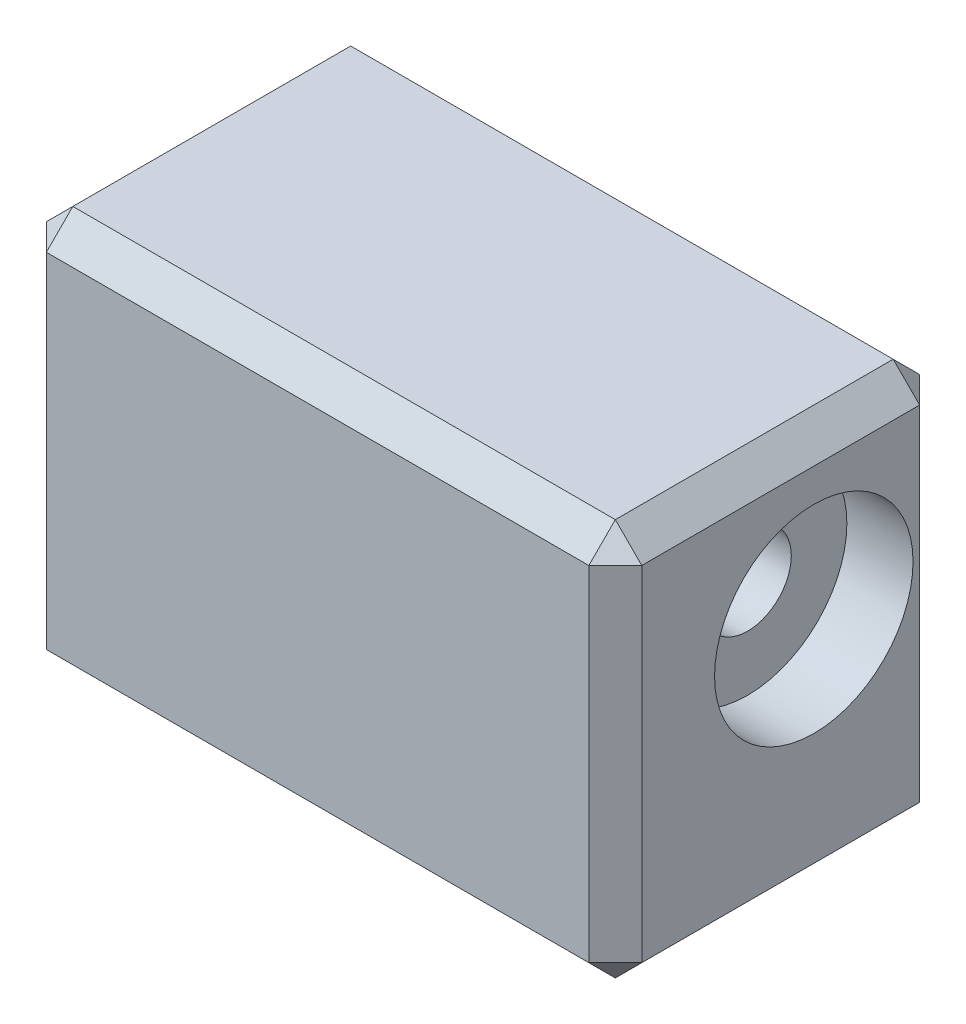
ISO-10303-21;
HEADER;
FILE_DESCRIPTION(('STEP AP214'),'2;1');
FILE_NAME('part.step','',(''),(''),'','','');
FILE_SCHEMA(('AUTOMOTIVE_DESIGN { 1 0 10303 214 1 1 1 1 }'));
ENDSEC;
DATA;
#1=APPLICATION_CONTEXT('core data for automotive mechanical design processes');
#2=APPLICATION_PROTOCOL_DEFINITION('international standard','automotive_design',2000,#1);
#3=PRODUCT_CONTEXT('',#1,'mechanical');
#4=PRODUCT('Part','Part','',(#3));
#5=PRODUCT_RELATED_PRODUCT_CATEGORY('part','',(#4));
#6=PRODUCT_DEFINITION_FORMATION('','',#4);
#7=PRODUCT_DEFINITION_CONTEXT('part definition',#1,'design');
#8=PRODUCT_DEFINITION('design','',#6,#7);
#9=PRODUCT_DEFINITION_SHAPE('','',#8);
#10=(LENGTH_UNIT() NAMED_UNIT(*) SI_UNIT(.MILLI.,.METRE.));
#11=(NAMED_UNIT(*) PLANE_ANGLE_UNIT() SI_UNIT($,.RADIAN.));
#12=(NAMED_UNIT(*) SI_UNIT($,.STERADIAN.) SOLID_ANGLE_UNIT());
#13=UNCERTAINTY_MEASURE_WITH_UNIT(LENGTH_MEASURE(1.E-05),#10,'distance_accuracy_value','');
#14=(GEOMETRIC_REPRESENTATION_CONTEXT(3) GLOBAL_UNCERTAINTY_ASSIGNED_CONTEXT((#13)) GLOBAL_UNIT_ASSIGNED_CONTEXT((#10,
#11,#12)) REPRESENTATION_CONTEXT('',''));
#15=CARTESIAN_POINT('',(0.,0.,0.));
#16=DIRECTION('',(0.,0.,1.));
#17=DIRECTION('',(1.,0.,0.));
#18=AXIS2_PLACEMENT_3D('',#15,#16,#17);
#19=CARTESIAN_POINT('',(0.,18.,-15.));
#20=DIRECTION('',(1.,0.,0.));
#21=DIRECTION('',(0.,0.,-1.));
#22=AXIS2_PLACEMENT_3D('',#19,#20,#21);
#23=CYLINDRICAL_SURFACE('',#22,3.29999999999999);
#24=CARTESIAN_POINT('',(-32.5,18.,-11.7));
#25=CARTESIAN_POINT('',(-32.5000002512976,18.180160664798,-11.6999995149712));
#26=CARTESIAN_POINT('',(-32.4950862523575,18.3603191481547,-11.7148016749699));
#27=CARTESIAN_POINT('',(-32.475966963423,18.7153357503385,-11.7734422990553));
#28=CARTESIAN_POINT('',(-32.4617605251427,18.8901932113126,-11.8172843516706));
#29=CARTESIAN_POINT('',(-32.425601362864,19.2294381519048,-11.9323426247766));
#30=CARTESIAN_POINT('',(-32.4036614375337,19.3938424037999,-12.0035136340281));
#31=CARTESIAN_POINT('',(-32.3542789449768,19.708381291749,-12.1710071453837));
#32=CARTESIAN_POINT('',(-32.3268353267193,19.8585131941521,-12.2673344526069));
#33=CARTESIAN_POINT('',(-32.2682933595203,20.1453540051203,-12.4858496461428));
#34=CARTESIAN_POINT('',(-32.2371087377317,20.281510042736,-12.6087400365483));
#35=CARTESIAN_POINT('',(-32.1750781560801,20.5317009452083,-12.8753990278397));
#36=CARTESIAN_POINT('',(-32.1442322701586,20.645731067395,-13.0191720933854));
#37=CARTESIAN_POINT('',(-32.0854262634667,20.8515631102477,-13.3284612247589));
#38=CARTESIAN_POINT('',(-32.0575714979767,20.9426509429274,-13.4944744751703));
#39=CARTESIAN_POINT('',(-32.0092109896754,21.095379000141,-13.8405312616682));
#40=CARTESIAN_POINT('',(-31.9887030555499,21.1570280071223,-14.0205705947047));
#41=CARTESIAN_POINT('',(-31.958265652702,21.2470626998285,-14.3832896581625));
#42=CARTESIAN_POINT('',(-31.9480082447153,21.2764826834664,-14.5656843266513));
#43=CARTESIAN_POINT('',(-31.938262692959,21.3044572232771,-14.933087225388));
#44=CARTESIAN_POINT('',(-31.9387712995073,21.3030210932527,-15.1180946501355));
#45=CARTESIAN_POINT('',(-31.9502125821514,21.2701282019744,-15.4766944047846));
#46=CARTESIAN_POINT('',(-31.9606785775936,21.2400153930326,-15.6504274704776));
#47=CARTESIAN_POINT('',(-31.9900926504697,21.1528141786995,-15.9902218123335));
#48=CARTESIAN_POINT('',(-32.0090417245488,21.0957226036301,-16.1562821845305));
#49=CARTESIAN_POINT('',(-32.05362347882,20.9552934848174,-16.4790948799893));
#50=CARTESIAN_POINT('',(-32.0793574389537,20.8715538624727,-16.6356577004506));
#51=CARTESIAN_POINT('',(-32.1345663183206,20.6804848477663,-16.932936724603));
#52=CARTESIAN_POINT('',(-32.1640422997438,20.5731487510831,-17.0736484073881));
#53=CARTESIAN_POINT('',(-32.2252559648513,20.3314560346881,-17.3427904548204));
#54=CARTESIAN_POINT('',(-32.2570322518803,20.1959989077779,-17.4702257572863));
#55=CARTESIAN_POINT('',(-32.3179466917306,19.9052447271162,-17.7008283564784));
#56=CARTESIAN_POINT('',(-32.3470846013613,19.7499458476394,-17.80399341751));
#57=CARTESIAN_POINT('',(-32.3998085851988,19.4218377567204,-17.983907033674));
#58=CARTESIAN_POINT('',(-32.4233389587223,19.248875430006,-18.0603937944261));
#59=CARTESIAN_POINT('',(-32.4617926902947,18.8915776411687,-18.1828794392126));
#60=CARTESIAN_POINT('',(-32.4767189759167,18.7072460711333,-18.2288886941282));
#61=CARTESIAN_POINT('',(-32.4958000385908,18.3408698738856,-18.2873615707665));
#62=CARTESIAN_POINT('',(-32.5003864168188,18.1590620898807,-18.3011701872789));
#63=CARTESIAN_POINT('',(-32.4995624079864,17.7956940058516,-18.2986747346175));
#64=CARTESIAN_POINT('',(-32.4941536704685,17.6141336699386,-18.2823756342665));
#65=CARTESIAN_POINT('',(-32.4742318578163,17.26176544781,-18.2211943476342));
#66=CARTESIAN_POINT('',(-32.4599805961299,17.0907986858431,-18.1771335799709));
#67=CARTESIAN_POINT('',(-32.4240722043328,16.758749213228,-18.0627026169765));
#68=CARTESIAN_POINT('',(-32.4024141336752,16.5976677609223,-17.9923290802362));
#69=CARTESIAN_POINT('',(-32.3531947638051,16.2852928322987,-17.8252379608953));
#70=CARTESIAN_POINT('',(-32.3254945719897,16.1343629227264,-17.727882770471));
#71=CARTESIAN_POINT('',(-32.2673361267806,15.8505424044173,-17.5103435304082));
#72=CARTESIAN_POINT('',(-32.2368770474717,15.7176572276007,-17.3901526326521));
#73=CARTESIAN_POINT('',(-32.1749181969498,15.4675490429625,-17.1240276546161));
#74=CARTESIAN_POINT('',(-32.1434324032,15.3512856810013,-16.9771862661526));
#75=CARTESIAN_POINT('',(-32.0843713409326,15.1449371451529,-16.6654002902126));
#76=CARTESIAN_POINT('',(-32.0567960873326,15.0548520711271,-16.5004556336815));
#77=CARTESIAN_POINT('',(-32.0089549374067,14.9038618312959,-16.1571490320833));
#78=CARTESIAN_POINT('',(-31.9886717638273,14.8428875786643,-15.9788200280456));
#79=CARTESIAN_POINT('',(-31.957985324936,14.7520999216941,-15.6136041958408));
#80=CARTESIAN_POINT('',(-31.9475777255182,14.7222728471752,-15.426721159576));
#81=CARTESIAN_POINT('',(-31.9383070548971,14.6956790104583,-15.0598291501742));
#82=CARTESIAN_POINT('',(-31.9388888483573,14.6973225526984,-14.8799481272437));
#83=CARTESIAN_POINT('',(-31.9501627898112,14.7297231487097,-14.5231668008197));
#84=CARTESIAN_POINT('',(-31.9608543586442,14.7604785347449,-14.3462663271698));
#85=CARTESIAN_POINT('',(-31.9907338752892,14.8491141624954,-14.0036717256308));
#86=CARTESIAN_POINT('',(-32.0097633057873,14.9064894581406,-13.8378320556851));
#87=CARTESIAN_POINT('',(-32.0541187123027,15.0463291811991,-13.5180050146749));
#88=CARTESIAN_POINT('',(-32.0794460678687,15.1287991064305,-13.3640202500962));
#89=CARTESIAN_POINT('',(-32.1348987869753,15.3206183163387,-13.0651130912672));
#90=CARTESIAN_POINT('',(-32.1651834088698,15.4309692226804,-12.9208631778605));
#91=CARTESIAN_POINT('',(-32.2264608612613,15.6737133730493,-12.65241483865));
#92=CARTESIAN_POINT('',(-32.257453888066,15.8061127924799,-12.5282220497465));
#93=CARTESIAN_POINT('',(-32.3180663509755,16.0952246465318,-12.2986733363815));
#94=CARTESIAN_POINT('',(-32.3475891782265,16.2526684837237,-12.1942099566295));
#95=CARTESIAN_POINT('',(-32.4006350049759,16.5838458358975,-12.0133502842045));
#96=CARTESIAN_POINT('',(-32.424159676805,16.757574791951,-11.9369461657773));
#97=CARTESIAN_POINT('',(-32.4615390606492,17.1072269162556,-11.817973969939));
#98=CARTESIAN_POINT('',(-32.4758274352643,17.2825816898321,-11.7738729550321));
#99=CARTESIAN_POINT('',(-32.4950565496163,17.6386259842331,-11.7148900559136));
#100=CARTESIAN_POINT('',(-32.4999997479697,17.8193140892063,-11.7000004864429));
#101=CARTESIAN_POINT('',(-32.5,18.,-11.7));
#102=B_SPLINE_CURVE_WITH_KNOTS('',3,(#24,#25,#26,#27,#28,#29,#30,#31,#32,#33,#34,#35,#36,#37,
#38,#39,#40,#41,#42,#43,#44,#45,#46,#47,#48,#49,#50,#51,#52,#53,#54,#55,#56,#57,#58,#59,#60,#61,
#62,#63,#64,#65,#66,#67,#68,#69,#70,#71,#72,#73,#74,#75,#76,#77,#78,#79,#80,#81,#82,#83,#84,#85,
#86,#87,#88,#89,#90,#91,#92,#93,#94,#95,#96,#97,#98,#99,#100,#101),.UNSPECIFIED.,.T.,.F.,(4,2,2,
2,2,2,2,2,2,2,2,2,2,2,2,2,2,2,2,2,2,2,2,2,2,2,2,2,2,2,2,2,2,2,2,2,2,2,4),(0.,0.539817208265,
1.07970113547449,1.61869573537818,2.15779336434886,2.71342431531901,3.26917423403135,
3.84052978296232,4.41171477346802,4.96397738716931,5.51607330480344,6.04350590661005,
6.57100049076742,7.1068649888257,7.64288193600406,8.20629053674587,8.76975101652769,
9.33859468436013,9.90724468658344,10.4516808212029,10.9960271129078,11.5249783024989,
12.053996685433,12.596775030148,13.1397164043473,13.706809454363,14.2739046676217,
14.8396472568357,15.4051414428814,15.9421493724921,16.4791265402818,17.0063100722481,
17.5336091846618,18.0835367682512,18.6336186368047,19.2045531990539,19.7753284059748,
20.3168619056248,20.8582529137388),.UNSPECIFIED.);
#103=CARTESIAN_POINT('',(-32.5,18.,-11.7));
#104=VERTEX_POINT('',#103);
#105=EDGE_CURVE('E233',#104,#104,#102,.T.);
#106=ORIENTED_EDGE('',*,*,#105,.F.);
#107=EDGE_LOOP('',(#106));
#108=FACE_BOUND('',#107,.T.);
#109=CARTESIAN_POINT('',(-42.,18.,-15.));
#110=DIRECTION('',(-1.,0.,0.));
#111=DIRECTION('',(0.,0.,1.));
#112=AXIS2_PLACEMENT_3D('',#109,#110,#111);
#113=CIRCLE('',#112,3.29999999999999);
#114=CARTESIAN_POINT('',(-42.,18.,-11.7));
#115=VERTEX_POINT('',#114);
#116=EDGE_CURVE('E44',#115,#115,#113,.F.);
#117=ORIENTED_EDGE('',*,*,#116,.F.);
#118=EDGE_LOOP('',(#117));
#119=FACE_BOUND('',#118,.T.);
#120=ADVANCED_FACE('F39',(#108,#119),#23,.F.);
#121=CARTESIAN_POINT('',(0.,30.,0.));
#122=DIRECTION('',(-1.,0.,0.));
#123=DIRECTION('',(0.,0.,1.));
#124=AXIS2_PLACEMENT_3D('',#121,#122,#123);
#125=PLANE('',#124);
#126=DIRECTION('',(0.,1.,0.));
#127=VECTOR('',#126,1.);
#128=CARTESIAN_POINT('',(0.,30.,-23.));
#129=LINE('',#128,#127);
#130=CARTESIAN_POINT('',(0.,2.,-23.));
#131=VERTEX_POINT('',#130);
#132=CARTESIAN_POINT('',(0.,28.,-23.));
#133=VERTEX_POINT('',#132);
#134=EDGE_CURVE('E320',#131,#133,#129,.T.);
#135=ORIENTED_EDGE('',*,*,#134,.T.);
#136=DIRECTION('',(0.,0.,1.));
#137=VECTOR('',#136,1.);
#138=CARTESIAN_POINT('',(0.,28.,0.));
#139=LINE('',#138,#137);
#140=CARTESIAN_POINT('',(0.,28.,-2.));
#141=VERTEX_POINT('',#140);
#142=EDGE_CURVE('E314',#133,#141,#139,.T.);
#143=ORIENTED_EDGE('',*,*,#142,.T.);
#144=DIRECTION('',(0.,-1.,0.));
#145=VECTOR('',#144,1.);
#146=CARTESIAN_POINT('',(0.,30.,-2.));
#147=LINE('',#146,#145);
#148=CARTESIAN_POINT('',(0.,2.,-2.));
#149=VERTEX_POINT('',#148);
#150=EDGE_CURVE('E308',#141,#149,#147,.T.);
#151=ORIENTED_EDGE('',*,*,#150,.T.);
#152=DIRECTION('',(0.,0.,-1.));
#153=VECTOR('',#152,1.);
#154=CARTESIAN_POINT('',(0.,2.,0.));
#155=LINE('',#154,#153);
#156=EDGE_CURVE('E315',#149,#131,#155,.T.);
#157=ORIENTED_EDGE('',*,*,#156,.T.);
#158=EDGE_LOOP('',(#135,#143,#151,#157));
#159=FACE_BOUND('',#158,.T.);
#160=CARTESIAN_POINT('',(0.,18.,-15.));
#161=DIRECTION('',(1.,0.,0.));
#162=DIRECTION('',(0.,0.,-1.));
#163=AXIS2_PLACEMENT_3D('',#160,#161,#162);
#164=CIRCLE('',#163,7.5);
#165=CARTESIAN_POINT('',(0.,18.,-22.5));
#166=VERTEX_POINT('',#165);
#167=EDGE_CURVE('E208',#166,#166,#164,.T.);
#168=ORIENTED_EDGE('',*,*,#167,.F.);
#169=EDGE_LOOP('',(#168));
#170=FACE_BOUND('',#169,.T.);
#171=ADVANCED_FACE('F251',(#159,#170),#125,.F.);
#172=CARTESIAN_POINT('',(0.,30.,-25.));
#173=DIRECTION('',(0.,0.,1.));
#174=DIRECTION('',(1.,0.,0.));
#175=AXIS2_PLACEMENT_3D('',#172,#173,#174);
#176=PLANE('',#175);
#177=CARTESIAN_POINT('',(-22.5,18.,-25.));
#178=DIRECTION('',(0.,0.,-1.));
#179=DIRECTION('',(-1.,0.,0.));
#180=AXIS2_PLACEMENT_3D('',#177,#178,#179);
#181=CIRCLE('',#180,9.99999999999999);
#182=CARTESIAN_POINT('',(-22.5,28.,-25.));
#183=VERTEX_POINT('',#182);
#184=EDGE_CURVE('E230',#183,#183,#181,.T.);
#185=ORIENTED_EDGE('',*,*,#184,.F.);
#186=DIRECTION('',(1.,0.,0.));
#187=VECTOR('',#186,1.);
#188=CARTESIAN_POINT('',(0.,28.,-25.));
#189=LINE('',#188,#187);
#190=CARTESIAN_POINT('',(-2.00000000000001,28.,-25.));
#191=VERTEX_POINT('',#190);
#192=EDGE_CURVE('E275',#183,#191,#189,.T.);
#193=ORIENTED_EDGE('',*,*,#192,.T.);
#194=DIRECTION('',(0.,-1.,0.));
#195=VECTOR('',#194,1.);
#196=CARTESIAN_POINT('',(-2.00000000000001,30.,-25.));
#197=LINE('',#196,#195);
#198=CARTESIAN_POINT('',(-2.00000000000001,2.00000000000001,-25.));
#199=VERTEX_POINT('',#198);
#200=EDGE_CURVE('E281',#191,#199,#197,.T.);
#201=ORIENTED_EDGE('',*,*,#200,.T.);
#202=DIRECTION('',(-1.,0.,0.));
#203=VECTOR('',#202,1.);
#204=CARTESIAN_POINT('',(0.,2.00000000000001,-25.));
#205=LINE('',#204,#203);
#206=CARTESIAN_POINT('',(-43.,2.00000000000001,-25.));
#207=VERTEX_POINT('',#206);
#208=EDGE_CURVE('E347',#199,#207,#205,.T.);
#209=ORIENTED_EDGE('',*,*,#208,.T.);
#210=DIRECTION('',(0.,1.,0.));
#211=VECTOR('',#210,1.);
#212=CARTESIAN_POINT('',(-43.,30.,-25.));
#213=LINE('',#212,#211);
#214=CARTESIAN_POINT('',(-43.,28.,-25.));
#215=VERTEX_POINT('',#214);
#216=EDGE_CURVE('E345',#207,#215,#213,.T.);
#217=ORIENTED_EDGE('',*,*,#216,.T.);
#218=DIRECTION('',(1.,0.,0.));
#219=VECTOR('',#218,1.);
#220=CARTESIAN_POINT('',(0.,28.,-25.));
#221=LINE('',#220,#219);
#222=EDGE_CURVE('E165',#215,#183,#221,.T.);
#223=ORIENTED_EDGE('',*,*,#222,.T.);
#224=EDGE_LOOP('',(#185,#193,#201,#209,#217,#223));
#225=FACE_BOUND('',#224,.T.);
#226=ADVANCED_FACE('F273',(#225),#176,.F.);
#227=CARTESIAN_POINT('',(-45.,30.,0.));
#228=DIRECTION('',(1.,0.,0.));
#229=DIRECTION('',(0.,0.,-1.));
#230=AXIS2_PLACEMENT_3D('',#227,#228,#229);
#231=PLANE('',#230);
#232=CARTESIAN_POINT('',(-45.,18.,-15.));
#233=DIRECTION('',(-1.,0.,0.));
#234=DIRECTION('',(0.,0.,1.));
#235=AXIS2_PLACEMENT_3D('',#232,#233,#234);
#236=CIRCLE('',#235,6.);
#237=CARTESIAN_POINT('',(-45.,18.,-9.00000000000001));
#238=VERTEX_POINT('',#237);
#239=EDGE_CURVE('E222',#238,#238,#236,.T.);
#240=ORIENTED_EDGE('',*,*,#239,.F.);
#241=EDGE_LOOP('',(#240));
#242=FACE_BOUND('',#241,.T.);
#243=DIRECTION('',(0.,-1.,0.));
#244=VECTOR('',#243,1.);
#245=CARTESIAN_POINT('',(-45.,30.,-23.));
#246=LINE('',#245,#244);
#247=CARTESIAN_POINT('',(-45.,28.,-23.));
#248=VERTEX_POINT('',#247);
#249=CARTESIAN_POINT('',(-45.,2.,-23.));
#250=VERTEX_POINT('',#249);
#251=EDGE_CURVE('E280',#248,#250,#246,.T.);
#252=ORIENTED_EDGE('',*,*,#251,.T.);
#253=DIRECTION('',(0.,0.,1.));
#254=VECTOR('',#253,1.);
#255=CARTESIAN_POINT('',(-45.,2.,0.));
#256=LINE('',#255,#254);
#257=CARTESIAN_POINT('',(-45.,2.,-1.99999999999999));
#258=VERTEX_POINT('',#257);
#259=EDGE_CURVE('E11',#250,#258,#256,.T.);
#260=ORIENTED_EDGE('',*,*,#259,.T.);
#261=DIRECTION('',(0.,1.,0.));
#262=VECTOR('',#261,1.);
#263=CARTESIAN_POINT('',(-45.,30.,-1.99999999999999));
#264=LINE('',#263,#262);
#265=CARTESIAN_POINT('',(-45.,28.,-1.99999999999999));
#266=VERTEX_POINT('',#265);
#267=EDGE_CURVE('E49',#258,#266,#264,.T.);
#268=ORIENTED_EDGE('',*,*,#267,.T.);
#269=DIRECTION('',(0.,0.,-1.));
#270=VECTOR('',#269,1.);
#271=CARTESIAN_POINT('',(-45.,28.,-25.));
#272=LINE('',#271,#270);
#273=EDGE_CURVE('E283',#266,#248,#272,.T.);
#274=ORIENTED_EDGE('',*,*,#273,.T.);
#275=EDGE_LOOP('',(#252,#260,#268,#274));
#276=FACE_BOUND('',#275,.T.);
#277=ADVANCED_FACE('F363',(#242,#276),#231,.F.);
#278=CARTESIAN_POINT('',(0.,30.,0.));
#279=DIRECTION('',(0.,0.,-1.));
#280=DIRECTION('',(-1.,0.,0.));
#281=AXIS2_PLACEMENT_3D('',#278,#279,#280);
#282=PLANE('',#281);
#283=DIRECTION('',(0.,1.,0.));
#284=VECTOR('',#283,1.);
#285=CARTESIAN_POINT('',(-2.00000000000001,30.,0.));
#286=LINE('',#285,#284);
#287=CARTESIAN_POINT('',(-2.00000000000001,2.,0.));
#288=VERTEX_POINT('',#287);
#289=CARTESIAN_POINT('',(-2.00000000000001,28.,0.));
#290=VERTEX_POINT('',#289);
#291=EDGE_CURVE('E331',#288,#290,#286,.T.);
#292=ORIENTED_EDGE('',*,*,#291,.T.);
#293=DIRECTION('',(-1.,0.,0.));
#294=VECTOR('',#293,1.);
#295=CARTESIAN_POINT('',(-45.,28.,0.));
#296=LINE('',#295,#294);
#297=CARTESIAN_POINT('',(-43.,28.,0.));
#298=VERTEX_POINT('',#297);
#299=EDGE_CURVE('E333',#290,#298,#296,.T.);
#300=ORIENTED_EDGE('',*,*,#299,.T.);
#301=DIRECTION('',(0.,-1.,0.));
#302=VECTOR('',#301,1.);
#303=CARTESIAN_POINT('',(-43.,30.,0.));
#304=LINE('',#303,#302);
#305=CARTESIAN_POINT('',(-43.,2.,0.));
#306=VERTEX_POINT('',#305);
#307=EDGE_CURVE('E324',#298,#306,#304,.T.);
#308=ORIENTED_EDGE('',*,*,#307,.T.);
#309=DIRECTION('',(1.,0.,0.));
#310=VECTOR('',#309,1.);
#311=CARTESIAN_POINT('',(0.,2.,0.));
#312=LINE('',#311,#310);
#313=EDGE_CURVE('E326',#306,#288,#312,.T.);
#314=ORIENTED_EDGE('',*,*,#313,.T.);
#315=EDGE_LOOP('',(#292,#300,#308,#314));
#316=FACE_BOUND('',#315,.T.);
#317=ADVANCED_FACE('F380',(#316),#282,.F.);
#318=CARTESIAN_POINT('',(0.,30.,0.));
#319=DIRECTION('',(0.,1.,0.));
#320=DIRECTION('',(0.,0.,1.));
#321=AXIS2_PLACEMENT_3D('',#318,#319,#320);
#322=PLANE('',#321);
#323=DIRECTION('',(1.,0.,0.));
#324=VECTOR('',#323,1.);
#325=CARTESIAN_POINT('',(0.,30.,-2.));
#326=LINE('',#325,#324);
#327=CARTESIAN_POINT('',(-43.,30.,-1.99999999999999));
#328=VERTEX_POINT('',#327);
#329=CARTESIAN_POINT('',(-2.,30.,-2.));
#330=VERTEX_POINT('',#329);
#331=EDGE_CURVE('E142',#328,#330,#326,.T.);
#332=ORIENTED_EDGE('',*,*,#331,.T.);
#333=DIRECTION('',(0.,0.,-1.));
#334=VECTOR('',#333,1.);
#335=CARTESIAN_POINT('',(-2.,30.,-25.));
#336=LINE('',#335,#334);
#337=CARTESIAN_POINT('',(-2.,30.,-23.));
#338=VERTEX_POINT('',#337);
#339=EDGE_CURVE('E138',#330,#338,#336,.T.);
#340=ORIENTED_EDGE('',*,*,#339,.T.);
#341=DIRECTION('',(-1.,0.,0.));
#342=VECTOR('',#341,1.);
#343=CARTESIAN_POINT('',(-45.,30.,-23.));
#344=LINE('',#343,#342);
#345=CARTESIAN_POINT('',(-43.,30.,-23.));
#346=VERTEX_POINT('',#345);
#347=EDGE_CURVE('E132',#338,#346,#344,.T.);
#348=ORIENTED_EDGE('',*,*,#347,.T.);
#349=DIRECTION('',(0.,0.,1.));
#350=VECTOR('',#349,1.);
#351=CARTESIAN_POINT('',(-43.,30.,0.));
#352=LINE('',#351,#350);
#353=EDGE_CURVE('E135',#346,#328,#352,.T.);
#354=ORIENTED_EDGE('',*,*,#353,.T.);
#355=EDGE_LOOP('',(#332,#340,#348,#354));
#356=FACE_BOUND('',#355,.T.);
#357=ADVANCED_FACE('F134',(#356),#322,.T.);
#358=CARTESIAN_POINT('',(0.,0.,0.));
#359=DIRECTION('',(0.,1.,0.));
#360=DIRECTION('',(0.,0.,1.));
#361=AXIS2_PLACEMENT_3D('',#358,#359,#360);
#362=PLANE('',#361);
#363=DIRECTION('',(0.,0.,1.));
#364=VECTOR('',#363,1.);
#365=CARTESIAN_POINT('',(-2.00000000000001,0.,0.));
#366=LINE('',#365,#364);
#367=CARTESIAN_POINT('',(-2.00000000000001,0.,-23.));
#368=VERTEX_POINT('',#367);
#369=CARTESIAN_POINT('',(-2.00000000000001,0.,-2.00000000000001));
#370=VERTEX_POINT('',#369);
#371=EDGE_CURVE('E340',#368,#370,#366,.T.);
#372=ORIENTED_EDGE('',*,*,#371,.T.);
#373=DIRECTION('',(-1.,0.,0.));
#374=VECTOR('',#373,1.);
#375=CARTESIAN_POINT('',(0.,0.,-2.00000000000001));
#376=LINE('',#375,#374);
#377=CARTESIAN_POINT('',(-43.,0.,-2.));
#378=VERTEX_POINT('',#377);
#379=EDGE_CURVE('E342',#370,#378,#376,.T.);
#380=ORIENTED_EDGE('',*,*,#379,.T.);
#381=DIRECTION('',(0.,0.,-1.));
#382=VECTOR('',#381,1.);
#383=CARTESIAN_POINT('',(-43.,0.,0.));
#384=LINE('',#383,#382);
#385=CARTESIAN_POINT('',(-43.,0.,-23.));
#386=VERTEX_POINT('',#385);
#387=EDGE_CURVE('E336',#378,#386,#384,.T.);
#388=ORIENTED_EDGE('',*,*,#387,.T.);
#389=DIRECTION('',(1.,0.,0.));
#390=VECTOR('',#389,1.);
#391=CARTESIAN_POINT('',(0.,0.,-23.));
#392=LINE('',#391,#390);
#393=EDGE_CURVE('E338',#386,#368,#392,.T.);
#394=ORIENTED_EDGE('',*,*,#393,.T.);
#395=EDGE_LOOP('',(#372,#380,#388,#394));
#396=FACE_BOUND('',#395,.T.);
#397=ADVANCED_FACE('F266',(#396),#362,.F.);
#398=CARTESIAN_POINT('',(-22.5,18.,-7.));
#399=DIRECTION('',(0.,0.,-1.));
#400=DIRECTION('',(-1.,0.,0.));
#401=AXIS2_PLACEMENT_3D('',#398,#399,#400);
#402=CYLINDRICAL_SURFACE('',#401,9.99999999999999);
#403=ORIENTED_EDGE('',*,*,#105,.T.);
#404=EDGE_LOOP('',(#403));
#405=FACE_BOUND('',#404,.T.);
#406=CARTESIAN_POINT('',(-12.5,18.,-18.3));
#407=CARTESIAN_POINT('',(-12.4999997487024,18.180160664798,-18.3000004850288));
#408=CARTESIAN_POINT('',(-12.5049137476425,18.3603191481547,-18.2851983250301));
#409=CARTESIAN_POINT('',(-12.524033036577,18.7153357503385,-18.2265577009447));
#410=CARTESIAN_POINT('',(-12.5382394748573,18.8901932113126,-18.1827156483294));
#411=CARTESIAN_POINT('',(-12.574398637136,19.2294381519048,-18.0676573752234));
#412=CARTESIAN_POINT('',(-12.5963385624663,19.3938424037999,-17.9964863659719));
#413=CARTESIAN_POINT('',(-12.6457210550232,19.708381291749,-17.8289928546163));
#414=CARTESIAN_POINT('',(-12.6731646732807,19.8585131941521,-17.7326655473932));
#415=CARTESIAN_POINT('',(-12.7317066404797,20.1453540051203,-17.5141503538572));
#416=CARTESIAN_POINT('',(-12.7628912622683,20.281510042736,-17.3912599634517));
#417=CARTESIAN_POINT('',(-12.8249218439199,20.5317009452083,-17.1246009721603));
#418=CARTESIAN_POINT('',(-12.8557677298414,20.645731067395,-16.9808279066146));
#419=CARTESIAN_POINT('',(-12.9145737365333,20.8515631102477,-16.6715387752411));
#420=CARTESIAN_POINT('',(-12.9424285020233,20.9426509429274,-16.5055255248297));
#421=CARTESIAN_POINT('',(-12.9907890103246,21.095379000141,-16.1594687383318));
#422=CARTESIAN_POINT('',(-13.0112969444501,21.1570280071223,-15.9794294052953));
#423=CARTESIAN_POINT('',(-13.041734347298,21.2470626998285,-15.6167103418375));
#424=CARTESIAN_POINT('',(-13.0519917552847,21.2764826834664,-15.4343156733487));
#425=CARTESIAN_POINT('',(-13.061737307041,21.3044572232771,-15.066912774612));
#426=CARTESIAN_POINT('',(-13.0612287004927,21.3030210932527,-14.8819053498645));
#427=CARTESIAN_POINT('',(-13.0497874178486,21.2701282019744,-14.5233055952154));
#428=CARTESIAN_POINT('',(-13.0393214224064,21.2400153930326,-14.3495725295224));
#429=CARTESIAN_POINT('',(-13.0099073495303,21.1528141786995,-14.0097781876666));
#430=CARTESIAN_POINT('',(-12.9909582754512,21.0957226036301,-13.8437178154695));
#431=CARTESIAN_POINT('',(-12.94637652118,20.9552934848174,-13.5209051200107));
#432=CARTESIAN_POINT('',(-12.9206425610463,20.8715538624727,-13.3643422995494));
#433=CARTESIAN_POINT('',(-12.8654336816794,20.6804848477663,-13.067063275397));
#434=CARTESIAN_POINT('',(-12.8359577002562,20.5731487510831,-12.9263515926119));
#435=CARTESIAN_POINT('',(-12.7747440351487,20.3314560346881,-12.6572095451796));
#436=CARTESIAN_POINT('',(-12.7429677481197,20.1959989077779,-12.5297742427137));
#437=CARTESIAN_POINT('',(-12.6820533082694,19.9052447271162,-12.2991716435216));
#438=CARTESIAN_POINT('',(-12.6529153986387,19.7499458476394,-12.19600658249));
#439=CARTESIAN_POINT('',(-12.6001914148012,19.4218377567204,-12.016092966326));
#440=CARTESIAN_POINT('',(-12.5766610412777,19.248875430006,-11.9396062055739));
#441=CARTESIAN_POINT('',(-12.5382073097053,18.8915776411687,-11.8171205607874));
#442=CARTESIAN_POINT('',(-12.5232810240833,18.7072460711333,-11.7711113058718));
#443=CARTESIAN_POINT('',(-12.5041999614092,18.3408698738856,-11.7126384292335));
#444=CARTESIAN_POINT('',(-12.4996135831812,18.1590620898807,-11.6988298127211));
#445=CARTESIAN_POINT('',(-12.5004375920136,17.7956940058516,-11.7013252653825));
#446=CARTESIAN_POINT('',(-12.5058463295315,17.6141336699386,-11.7176243657335));
#447=CARTESIAN_POINT('',(-12.5257681421837,17.26176544781,-11.7788056523658));
#448=CARTESIAN_POINT('',(-12.5400194038701,17.0907986858431,-11.8228664200291));
#449=CARTESIAN_POINT('',(-12.5759277956672,16.758749213228,-11.9372973830235));
#450=CARTESIAN_POINT('',(-12.5975858663248,16.5976677609223,-12.0076709197638));
#451=CARTESIAN_POINT('',(-12.6468052361949,16.2852928322987,-12.1747620391047));
#452=CARTESIAN_POINT('',(-12.6745054280103,16.1343629227264,-12.272117229529));
#453=CARTESIAN_POINT('',(-12.7326638732194,15.8505424044173,-12.4896564695918));
#454=CARTESIAN_POINT('',(-12.7631229525283,15.7176572276007,-12.6098473673479));
#455=CARTESIAN_POINT('',(-12.8250818030502,15.4675490429625,-12.8759723453839));
#456=CARTESIAN_POINT('',(-12.8565675968,15.3512856810013,-13.0228137338474));
#457=CARTESIAN_POINT('',(-12.9156286590674,15.1449371451529,-13.3345997097874));
#458=CARTESIAN_POINT('',(-12.9432039126674,15.0548520711271,-13.4995443663185));
#459=CARTESIAN_POINT('',(-12.9910450625933,14.9038618312959,-13.8428509679167));
#460=CARTESIAN_POINT('',(-13.0113282361727,14.8428875786643,-14.0211799719544));
#461=CARTESIAN_POINT('',(-13.042014675064,14.7520999216941,-14.3863958041592));
#462=CARTESIAN_POINT('',(-13.0524222744818,14.7222728471752,-14.5732788404241));
#463=CARTESIAN_POINT('',(-13.0616929451029,14.6956790104583,-14.9401708498258));
#464=CARTESIAN_POINT('',(-13.0611111516427,14.6973225526984,-15.1200518727563));
#465=CARTESIAN_POINT('',(-13.0498372101887,14.7297231487097,-15.4768331991803));
#466=CARTESIAN_POINT('',(-13.0391456413558,14.7604785347449,-15.6537336728302));
#467=CARTESIAN_POINT('',(-13.0092661247108,14.8491141624954,-15.9963282743692));
#468=CARTESIAN_POINT('',(-12.9902366942127,14.9064894581406,-16.1621679443149));
#469=CARTESIAN_POINT('',(-12.9458812876973,15.0463291811991,-16.4819949853252));
#470=CARTESIAN_POINT('',(-12.9205539321313,15.1287991064305,-16.6359797499038));
#471=CARTESIAN_POINT('',(-12.8651012130247,15.3206183163387,-16.9348869087328));
#472=CARTESIAN_POINT('',(-12.8348165911302,15.4309692226804,-17.0791368221395));
#473=CARTESIAN_POINT('',(-12.7735391387387,15.6737133730493,-17.34758516135));
#474=CARTESIAN_POINT('',(-12.742546111934,15.8061127924799,-17.4717779502535));
#475=CARTESIAN_POINT('',(-12.6819336490245,16.0952246465318,-17.7013266636185));
#476=CARTESIAN_POINT('',(-12.6524108217735,16.2526684837237,-17.8057900433705));
#477=CARTESIAN_POINT('',(-12.5993649950241,16.5838458358975,-17.9866497157955));
#478=CARTESIAN_POINT('',(-12.575840323195,16.757574791951,-18.0630538342227));
#479=CARTESIAN_POINT('',(-12.5384609393508,17.1072269162556,-18.1820260300611));
#480=CARTESIAN_POINT('',(-12.5241725647357,17.2825816898321,-18.226127044968));
#481=CARTESIAN_POINT('',(-12.5049434503837,17.6386259842331,-18.2851099440864));
#482=CARTESIAN_POINT('',(-12.5000002520303,17.8193140892063,-18.2999995135571));
#483=CARTESIAN_POINT('',(-12.5,18.,-18.3));
#484=B_SPLINE_CURVE_WITH_KNOTS('',3,(#406,#407,#408,#409,#410,#411,#412,#413,#414,#415,#416,
#417,#418,#419,#420,#421,#422,#423,#424,#425,#426,#427,#428,#429,#430,#431,#432,#433,#434,#435,
#436,#437,#438,#439,#440,#441,#442,#443,#444,#445,#446,#447,#448,#449,#450,#451,#452,#453,#454,
#455,#456,#457,#458,#459,#460,#461,#462,#463,#464,#465,#466,#467,#468,#469,#470,#471,#472,#473,
#474,#475,#476,#477,#478,#479,#480,#481,#482,#483),.UNSPECIFIED.,.T.,.F.,(4,2,2,2,2,2,2,2,2,2,2,
2,2,2,2,2,2,2,2,2,2,2,2,2,2,2,2,2,2,2,2,2,2,2,2,2,2,2,4),(0.,0.539817208264999,1.07970113547449,
1.61869573537818,2.15779336434886,2.713424315319,3.26917423403135,3.84052978296232,
4.41171477346802,4.96397738716931,5.51607330480344,6.04350590661005,6.57100049076742,
7.1068649888257,7.64288193600405,8.20629053674586,8.76975101652769,9.33859468436013,
9.90724468658345,10.4516808212029,10.9960271129078,11.5249783024989,12.053996685433,
12.596775030148,13.1397164043473,13.706809454363,14.2739046676217,14.8396472568357,
15.4051414428814,15.9421493724921,16.4791265402818,17.0063100722481,17.5336091846618,
18.0835367682512,18.6336186368047,19.2045531990539,19.7753284059748,20.3168619056248,
20.8582529137388),.UNSPECIFIED.);
#485=CARTESIAN_POINT('',(-12.5,18.,-18.3));
#486=VERTEX_POINT('',#485);
#487=EDGE_CURVE('E227',#486,#486,#484,.T.);
#488=ORIENTED_EDGE('',*,*,#487,.T.);
#489=EDGE_LOOP('',(#488));
#490=FACE_BOUND('',#489,.T.);
#491=CARTESIAN_POINT('',(-22.5,18.,-7.));
#492=DIRECTION('',(0.,0.,-1.));
#493=DIRECTION('',(-1.,0.,0.));
#494=AXIS2_PLACEMENT_3D('',#491,#492,#493);
#495=CIRCLE('',#494,9.99999999999999);
#496=CARTESIAN_POINT('',(-32.5,18.,-7.));
#497=VERTEX_POINT('',#496);
#498=EDGE_CURVE('E153',#497,#497,#495,.T.);
#499=ORIENTED_EDGE('',*,*,#498,.F.);
#500=EDGE_LOOP('',(#499));
#501=FACE_BOUND('',#500,.T.);
#502=ORIENTED_EDGE('',*,*,#184,.T.);
#503=EDGE_LOOP('',(#502));
#504=FACE_BOUND('',#503,.T.);
#505=ADVANCED_FACE('F244',(#405,#490,#501,#504),#402,.F.);
#506=CARTESIAN_POINT('',(-22.5,18.,-7.));
#507=DIRECTION('',(0.,0.,-1.));
#508=DIRECTION('',(-1.,0.,0.));
#509=AXIS2_PLACEMENT_3D('',#506,#507,#508);
#510=PLANE('',#509);
#511=ORIENTED_EDGE('',*,*,#498,.T.);
#512=EDGE_LOOP('',(#511));
#513=FACE_BOUND('',#512,.T.);
#514=ADVANCED_FACE('F256',(#513),#510,.T.);
#515=CARTESIAN_POINT('',(0.,18.,-15.));
#516=DIRECTION('',(1.,0.,0.));
#517=DIRECTION('',(0.,0.,-1.));
#518=AXIS2_PLACEMENT_3D('',#515,#516,#517);
#519=CYLINDRICAL_SURFACE('',#518,7.5);
#520=CARTESIAN_POINT('',(-5.,18.,-15.));
#521=DIRECTION('',(1.,0.,0.));
#522=DIRECTION('',(0.,0.,-1.));
#523=AXIS2_PLACEMENT_3D('',#520,#521,#522);
#524=CIRCLE('',#523,7.5);
#525=CARTESIAN_POINT('',(-5.,18.,-22.5));
#526=VERTEX_POINT('',#525);
#527=EDGE_CURVE('E214',#526,#526,#524,.T.);
#528=ORIENTED_EDGE('',*,*,#527,.F.);
#529=EDGE_LOOP('',(#528));
#530=FACE_BOUND('',#529,.T.);
#531=ORIENTED_EDGE('',*,*,#167,.T.);
#532=EDGE_LOOP('',(#531));
#533=FACE_BOUND('',#532,.T.);
#534=ADVANCED_FACE('F259',(#530,#533),#519,.F.);
#535=CARTESIAN_POINT('',(-5.,21.3,-15.));
#536=DIRECTION('',(-1.,0.,0.));
#537=DIRECTION('',(0.,0.,1.));
#538=AXIS2_PLACEMENT_3D('',#535,#536,#537);
#539=PLANE('',#538);
#540=CARTESIAN_POINT('',(-5.,18.,-15.));
#541=DIRECTION('',(1.,0.,0.));
#542=DIRECTION('',(0.,0.,-1.));
#543=AXIS2_PLACEMENT_3D('',#540,#541,#542);
#544=CIRCLE('',#543,3.29999999999999);
#545=CARTESIAN_POINT('',(-5.,18.,-18.3));
#546=VERTEX_POINT('',#545);
#547=EDGE_CURVE('E219',#546,#546,#544,.T.);
#548=ORIENTED_EDGE('',*,*,#547,.F.);
#549=EDGE_LOOP('',(#548));
#550=FACE_BOUND('',#549,.T.);
#551=ORIENTED_EDGE('',*,*,#527,.T.);
#552=EDGE_LOOP('',(#551));
#553=FACE_BOUND('',#552,.T.);
#554=ADVANCED_FACE('F254',(#550,#553),#539,.F.);
#555=ORIENTED_EDGE('',*,*,#547,.T.);
#556=EDGE_LOOP('',(#555));
#557=FACE_BOUND('',#556,.T.);
#558=ORIENTED_EDGE('',*,*,#487,.F.);
#559=EDGE_LOOP('',(#558));
#560=FACE_BOUND('',#559,.T.);
#561=ADVANCED_FACE('F253',(#557,#560),#23,.F.);
#562=CARTESIAN_POINT('',(-45.,2.,0.));
#563=DIRECTION('',(0.707106781186546,0.707106781186549,0.));
#564=DIRECTION('',(0.,0.,1.));
#565=AXIS2_PLACEMENT_3D('',#562,#563,#564);
#566=PLANE('',#565);
#567=DIRECTION('',(-0.707106781186549,0.707106781186546,0.));
#568=VECTOR('',#567,1.);
#569=CARTESIAN_POINT('',(-43.,0.,-2.));
#570=LINE('',#569,#568);
#571=EDGE_CURVE('E206',#258,#378,#570,.F.);
#572=ORIENTED_EDGE('',*,*,#571,.F.);
#573=ORIENTED_EDGE('',*,*,#259,.F.);
#574=DIRECTION('',(0.707106781186549,-0.707106781186546,0.));
#575=VECTOR('',#574,1.);
#576=CARTESIAN_POINT('',(-44.,0.999999999999999,-23.));
#577=LINE('',#576,#575);
#578=EDGE_CURVE('E204',#386,#250,#577,.F.);
#579=ORIENTED_EDGE('',*,*,#578,.F.);
#580=ORIENTED_EDGE('',*,*,#387,.F.);
#581=EDGE_LOOP('',(#572,#573,#579,#580));
#582=FACE_BOUND('',#581,.T.);
#583=ADVANCED_FACE('F42',(#582),#566,.F.);
#584=CARTESIAN_POINT('',(-43.,0.,-2.));
#585=DIRECTION('',(-0.577350269189624,-0.577350269189628,0.577350269189626));
#586=DIRECTION('',(0.,-0.707106781186547,-0.707106781186549));
#587=AXIS2_PLACEMENT_3D('',#584,#585,#586);
#588=PLANE('',#587);
#589=DIRECTION('',(0.707106781186549,0.,0.707106781186546));
#590=VECTOR('',#589,1.);
#591=CARTESIAN_POINT('',(-44.,2.,-0.999999999999994));
#592=LINE('',#591,#590);
#593=EDGE_CURVE('E200',#258,#306,#592,.T.);
#594=ORIENTED_EDGE('',*,*,#593,.F.);
#595=ORIENTED_EDGE('',*,*,#571,.T.);
#596=DIRECTION('',(0.,-0.707106781186546,-0.707106781186548));
#597=VECTOR('',#596,1.);
#598=CARTESIAN_POINT('',(-43.,0.,-2.));
#599=LINE('',#598,#597);
#600=EDGE_CURVE('E202',#306,#378,#599,.T.);
#601=ORIENTED_EDGE('',*,*,#600,.F.);
#602=EDGE_LOOP('',(#594,#595,#601));
#603=FACE_BOUND('',#602,.T.);
#604=ADVANCED_FACE('F388',(#603),#588,.T.);
#605=CARTESIAN_POINT('',(-43.,2.00000000000001,-25.));
#606=DIRECTION('',(-0.577350269189624,-0.577350269189625,-0.577350269189628));
#607=DIRECTION('',(0.,0.707106781186549,-0.707106781186546));
#608=AXIS2_PLACEMENT_3D('',#605,#606,#607);
#609=PLANE('',#608);
#610=DIRECTION('',(0.,0.707106781186549,-0.707106781186546));
#611=VECTOR('',#610,1.);
#612=CARTESIAN_POINT('',(-43.,2.00000000000001,-25.));
#613=LINE('',#612,#611);
#614=EDGE_CURVE('E194',#386,#207,#613,.T.);
#615=ORIENTED_EDGE('',*,*,#614,.F.);
#616=ORIENTED_EDGE('',*,*,#578,.T.);
#617=DIRECTION('',(-0.707106781186549,0.,0.707106781186546));
#618=VECTOR('',#617,1.);
#619=CARTESIAN_POINT('',(-43.,2.00000000000001,-25.));
#620=LINE('',#619,#618);
#621=EDGE_CURVE('E197',#207,#250,#620,.T.);
#622=ORIENTED_EDGE('',*,*,#621,.F.);
#623=EDGE_LOOP('',(#615,#616,#622));
#624=FACE_BOUND('',#623,.T.);
#625=ADVANCED_FACE('F357',(#624),#609,.T.);
#626=CARTESIAN_POINT('',(0.,2.,0.));
#627=DIRECTION('',(0.,0.707106781186549,-0.707106781186547));
#628=DIRECTION('',(1.,0.,0.));
#629=AXIS2_PLACEMENT_3D('',#626,#627,#628);
#630=PLANE('',#629);
#631=ORIENTED_EDGE('',*,*,#600,.T.);
#632=ORIENTED_EDGE('',*,*,#379,.F.);
#633=DIRECTION('',(0.,0.707106781186546,0.707106781186548));
#634=VECTOR('',#633,1.);
#635=CARTESIAN_POINT('',(-2.00000000000001,1.,-1.));
#636=LINE('',#635,#634);
#637=EDGE_CURVE('E188',#288,#370,#636,.F.);
#638=ORIENTED_EDGE('',*,*,#637,.F.);
#639=ORIENTED_EDGE('',*,*,#313,.F.);
#640=EDGE_LOOP('',(#631,#632,#638,#639));
#641=FACE_BOUND('',#640,.T.);
#642=ADVANCED_FACE('F371',(#641),#630,.F.);
#643=CARTESIAN_POINT('',(-43.,30.,0.));
#644=DIRECTION('',(0.707106781186546,0.,-0.707106781186549));
#645=DIRECTION('',(0.,-1.,0.));
#646=AXIS2_PLACEMENT_3D('',#643,#644,#645);
#647=PLANE('',#646);
#648=ORIENTED_EDGE('',*,*,#593,.T.);
#649=ORIENTED_EDGE('',*,*,#307,.F.);
#650=DIRECTION('',(-0.707106781186549,0.,-0.707106781186546));
#651=VECTOR('',#650,1.);
#652=CARTESIAN_POINT('',(-43.,28.,0.));
#653=LINE('',#652,#651);
#654=EDGE_CURVE('E185',#266,#298,#653,.F.);
#655=ORIENTED_EDGE('',*,*,#654,.F.);
#656=ORIENTED_EDGE('',*,*,#267,.F.);
#657=EDGE_LOOP('',(#648,#649,#655,#656));
#658=FACE_BOUND('',#657,.T.);
#659=ADVANCED_FACE('F387',(#658),#647,.F.);
#660=CARTESIAN_POINT('',(-43.,30.,0.));
#661=DIRECTION('',(-0.707106781186546,0.707106781186549,0.));
#662=DIRECTION('',(0.,0.,-1.));
#663=AXIS2_PLACEMENT_3D('',#660,#661,#662);
#664=PLANE('',#663);
#665=DIRECTION('',(0.707106781186549,0.707106781186546,0.));
#666=VECTOR('',#665,1.);
#667=CARTESIAN_POINT('',(-43.,30.,-23.));
#668=LINE('',#667,#666);
#669=EDGE_CURVE('E148',#248,#346,#668,.T.);
#670=ORIENTED_EDGE('',*,*,#669,.F.);
#671=ORIENTED_EDGE('',*,*,#273,.F.);
#672=DIRECTION('',(-0.707106781186549,-0.707106781186546,0.));
#673=VECTOR('',#672,1.);
#674=CARTESIAN_POINT('',(-44.,29.,-1.99999999999999));
#675=LINE('',#674,#673);
#676=EDGE_CURVE('E151',#328,#266,#675,.T.);
#677=ORIENTED_EDGE('',*,*,#676,.F.);
#678=ORIENTED_EDGE('',*,*,#353,.F.);
#679=EDGE_LOOP('',(#670,#671,#677,#678));
#680=FACE_BOUND('',#679,.T.);
#681=ADVANCED_FACE('F147',(#680),#664,.T.);
#682=CARTESIAN_POINT('',(-45.,30.,-23.));
#683=DIRECTION('',(0.707106781186546,0.,0.707106781186549));
#684=DIRECTION('',(0.,-1.,0.));
#685=AXIS2_PLACEMENT_3D('',#682,#683,#684);
#686=PLANE('',#685);
#687=ORIENTED_EDGE('',*,*,#621,.T.);
#688=ORIENTED_EDGE('',*,*,#251,.F.);
#689=DIRECTION('',(0.707106781186549,0.,-0.707106781186546));
#690=VECTOR('',#689,1.);
#691=CARTESIAN_POINT('',(-44.,28.,-24.));
#692=LINE('',#691,#690);
#693=EDGE_CURVE('E161',#215,#248,#692,.F.);
#694=ORIENTED_EDGE('',*,*,#693,.F.);
#695=ORIENTED_EDGE('',*,*,#216,.F.);
#696=EDGE_LOOP('',(#687,#688,#694,#695));
#697=FACE_BOUND('',#696,.T.);
#698=ADVANCED_FACE('F361',(#697),#686,.F.);
#699=CARTESIAN_POINT('',(0.,2.00000000000001,-25.));
#700=DIRECTION('',(0.,0.707106781186546,0.707106781186549));
#701=DIRECTION('',(-1.,0.,0.));
#702=AXIS2_PLACEMENT_3D('',#699,#700,#701);
#703=PLANE('',#702);
#704=ORIENTED_EDGE('',*,*,#614,.T.);
#705=ORIENTED_EDGE('',*,*,#208,.F.);
#706=DIRECTION('',(0.,-0.707106781186549,0.707106781186546));
#707=VECTOR('',#706,1.);
#708=CARTESIAN_POINT('',(-2.00000000000001,1.,-24.));
#709=LINE('',#708,#707);
#710=EDGE_CURVE('E180',#368,#199,#709,.F.);
#711=ORIENTED_EDGE('',*,*,#710,.F.);
#712=ORIENTED_EDGE('',*,*,#393,.F.);
#713=EDGE_LOOP('',(#704,#705,#711,#712));
#714=FACE_BOUND('',#713,.T.);
#715=ADVANCED_FACE('F355',(#714),#703,.F.);
#716=CARTESIAN_POINT('',(0.,2.,0.));
#717=DIRECTION('',(-0.707106781186546,0.707106781186549,0.));
#718=DIRECTION('',(0.,0.,-1.));
#719=AXIS2_PLACEMENT_3D('',#716,#717,#718);
#720=PLANE('',#719);
#721=DIRECTION('',(-0.707106781186549,-0.707106781186546,0.));
#722=VECTOR('',#721,1.);
#723=CARTESIAN_POINT('',(0.,2.,-2.));
#724=LINE('',#723,#722);
#725=EDGE_CURVE('E191',#370,#149,#724,.F.);
#726=ORIENTED_EDGE('',*,*,#725,.F.);
#727=ORIENTED_EDGE('',*,*,#371,.F.);
#728=DIRECTION('',(0.707106781186549,0.707106781186546,0.));
#729=VECTOR('',#728,1.);
#730=CARTESIAN_POINT('',(0.,2.,-23.));
#731=LINE('',#730,#729);
#732=EDGE_CURVE('E177',#131,#368,#731,.F.);
#733=ORIENTED_EDGE('',*,*,#732,.F.);
#734=ORIENTED_EDGE('',*,*,#156,.F.);
#735=EDGE_LOOP('',(#726,#727,#733,#734));
#736=FACE_BOUND('',#735,.T.);
#737=ADVANCED_FACE('F374',(#736),#720,.F.);
#738=CARTESIAN_POINT('',(0.,2.,-2.));
#739=DIRECTION('',(0.577350269189624,-0.577350269189628,0.577350269189626));
#740=DIRECTION('',(0.,-0.707106781186546,-0.707106781186549));
#741=AXIS2_PLACEMENT_3D('',#738,#739,#740);
#742=PLANE('',#741);
#743=ORIENTED_EDGE('',*,*,#637,.T.);
#744=ORIENTED_EDGE('',*,*,#725,.T.);
#745=DIRECTION('',(0.707106781186549,0.,-0.707106781186546));
#746=VECTOR('',#745,1.);
#747=CARTESIAN_POINT('',(0.,2.,-2.));
#748=LINE('',#747,#746);
#749=EDGE_CURVE('E169',#288,#149,#748,.T.);
#750=ORIENTED_EDGE('',*,*,#749,.F.);
#751=EDGE_LOOP('',(#743,#744,#750));
#752=FACE_BOUND('',#751,.T.);
#753=ADVANCED_FACE('F377',(#752),#742,.T.);
#754=CARTESIAN_POINT('',(-43.,28.,0.));
#755=DIRECTION('',(-0.577350269189624,0.577350269189626,0.577350269189628));
#756=DIRECTION('',(0.,-0.707106781186549,0.707106781186546));
#757=AXIS2_PLACEMENT_3D('',#754,#755,#756);
#758=PLANE('',#757);
#759=ORIENTED_EDGE('',*,*,#676,.T.);
#760=ORIENTED_EDGE('',*,*,#654,.T.);
#761=DIRECTION('',(0.,0.707106781186549,-0.707106781186546));
#762=VECTOR('',#761,1.);
#763=CARTESIAN_POINT('',(-43.,28.,0.));
#764=LINE('',#763,#762);
#765=EDGE_CURVE('E166',#328,#298,#764,.F.);
#766=ORIENTED_EDGE('',*,*,#765,.F.);
#767=EDGE_LOOP('',(#759,#760,#766));
#768=FACE_BOUND('',#767,.T.);
#769=ADVANCED_FACE('F386',(#768),#758,.T.);
#770=CARTESIAN_POINT('',(-43.,30.,-23.));
#771=DIRECTION('',(-0.577350269189624,0.577350269189625,-0.577350269189628));
#772=DIRECTION('',(0.,0.707106781186549,0.707106781186546));
#773=AXIS2_PLACEMENT_3D('',#770,#771,#772);
#774=PLANE('',#773);
#775=ORIENTED_EDGE('',*,*,#693,.T.);
#776=ORIENTED_EDGE('',*,*,#669,.T.);
#777=DIRECTION('',(0.,-0.707106781186549,-0.707106781186546));
#778=VECTOR('',#777,1.);
#779=CARTESIAN_POINT('',(-43.,30.,-23.));
#780=LINE('',#779,#778);
#781=EDGE_CURVE('E158',#215,#346,#780,.F.);
#782=ORIENTED_EDGE('',*,*,#781,.F.);
#783=EDGE_LOOP('',(#775,#776,#782));
#784=FACE_BOUND('',#783,.T.);
#785=ADVANCED_FACE('F157',(#784),#774,.T.);
#786=CARTESIAN_POINT('',(0.,2.,-23.));
#787=DIRECTION('',(0.577350269189624,-0.577350269189625,-0.577350269189628));
#788=DIRECTION('',(0.,0.707106781186549,-0.707106781186546));
#789=AXIS2_PLACEMENT_3D('',#786,#787,#788);
#790=PLANE('',#789);
#791=ORIENTED_EDGE('',*,*,#732,.T.);
#792=ORIENTED_EDGE('',*,*,#710,.T.);
#793=DIRECTION('',(-0.707106781186549,0.,-0.707106781186546));
#794=VECTOR('',#793,1.);
#795=CARTESIAN_POINT('',(0.,2.,-23.));
#796=LINE('',#795,#794);
#797=EDGE_CURVE('E167',#131,#199,#796,.T.);
#798=ORIENTED_EDGE('',*,*,#797,.F.);
#799=EDGE_LOOP('',(#791,#792,#798));
#800=FACE_BOUND('',#799,.T.);
#801=ADVANCED_FACE('F448',(#800),#790,.T.);
#802=CARTESIAN_POINT('',(0.,30.,-2.));
#803=DIRECTION('',(-0.707106781186546,0.,-0.707106781186549));
#804=DIRECTION('',(0.,-1.,0.));
#805=AXIS2_PLACEMENT_3D('',#802,#803,#804);
#806=PLANE('',#805);
#807=ORIENTED_EDGE('',*,*,#749,.T.);
#808=ORIENTED_EDGE('',*,*,#150,.F.);
#809=DIRECTION('',(-0.707106781186549,0.,0.707106781186546));
#810=VECTOR('',#809,1.);
#811=CARTESIAN_POINT('',(0.,28.,-2.));
#812=LINE('',#811,#810);
#813=EDGE_CURVE('E171',#290,#141,#812,.F.);
#814=ORIENTED_EDGE('',*,*,#813,.F.);
#815=ORIENTED_EDGE('',*,*,#291,.F.);
#816=EDGE_LOOP('',(#807,#808,#814,#815));
#817=FACE_BOUND('',#816,.T.);
#818=ADVANCED_FACE('F310',(#817),#806,.F.);
#819=CARTESIAN_POINT('',(0.,30.,-2.));
#820=DIRECTION('',(0.,0.707106781186546,0.707106781186549));
#821=DIRECTION('',(-1.,0.,0.));
#822=AXIS2_PLACEMENT_3D('',#819,#820,#821);
#823=PLANE('',#822);
#824=ORIENTED_EDGE('',*,*,#765,.T.);
#825=ORIENTED_EDGE('',*,*,#299,.F.);
#826=DIRECTION('',(0.,-0.707106781186549,0.707106781186546));
#827=VECTOR('',#826,1.);
#828=CARTESIAN_POINT('',(-2.,29.,-0.999999999999999));
#829=LINE('',#828,#827);
#830=EDGE_CURVE('E297',#330,#290,#829,.T.);
#831=ORIENTED_EDGE('',*,*,#830,.F.);
#832=ORIENTED_EDGE('',*,*,#331,.F.);
#833=EDGE_LOOP('',(#824,#825,#831,#832));
#834=FACE_BOUND('',#833,.T.);
#835=ADVANCED_FACE('F382',(#834),#823,.T.);
#836=CARTESIAN_POINT('',(0.,30.,-23.));
#837=DIRECTION('',(0.,0.707106781186546,-0.707106781186549));
#838=DIRECTION('',(1.,0.,0.));
#839=AXIS2_PLACEMENT_3D('',#836,#837,#838);
#840=PLANE('',#839);
#841=ORIENTED_EDGE('',*,*,#781,.T.);
#842=ORIENTED_EDGE('',*,*,#347,.F.);
#843=DIRECTION('',(0.,0.707106781186549,0.707106781186546));
#844=VECTOR('',#843,1.);
#845=CARTESIAN_POINT('',(-2.,30.,-23.));
#846=LINE('',#845,#844);
#847=EDGE_CURVE('E278',#191,#338,#846,.T.);
#848=ORIENTED_EDGE('',*,*,#847,.F.);
#849=ORIENTED_EDGE('',*,*,#192,.F.);
#850=ORIENTED_EDGE('',*,*,#222,.F.);
#851=EDGE_LOOP('',(#841,#842,#848,#849,#850));
#852=FACE_BOUND('',#851,.T.);
#853=ADVANCED_FACE('F163',(#852),#840,.T.);
#854=CARTESIAN_POINT('',(-2.00000000000001,30.,-25.));
#855=DIRECTION('',(-0.707106781186546,0.,0.707106781186549));
#856=DIRECTION('',(0.,-1.,0.));
#857=AXIS2_PLACEMENT_3D('',#854,#855,#856);
#858=PLANE('',#857);
#859=ORIENTED_EDGE('',*,*,#797,.T.);
#860=ORIENTED_EDGE('',*,*,#200,.F.);
#861=DIRECTION('',(0.707106781186549,0.,0.707106781186546));
#862=VECTOR('',#861,1.);
#863=CARTESIAN_POINT('',(-1.00000000000001,28.,-24.));
#864=LINE('',#863,#862);
#865=EDGE_CURVE('E294',#133,#191,#864,.F.);
#866=ORIENTED_EDGE('',*,*,#865,.F.);
#867=ORIENTED_EDGE('',*,*,#134,.F.);
#868=EDGE_LOOP('',(#859,#860,#866,#867));
#869=FACE_BOUND('',#868,.T.);
#870=ADVANCED_FACE('F470',(#869),#858,.F.);
#871=CARTESIAN_POINT('',(0.,28.,-2.));
#872=DIRECTION('',(0.577350269189626,0.577350269189624,0.577350269189628));
#873=DIRECTION('',(0.707106781186549,0.,-0.707106781186546));
#874=AXIS2_PLACEMENT_3D('',#871,#872,#873);
#875=PLANE('',#874);
#876=ORIENTED_EDGE('',*,*,#830,.T.);
#877=ORIENTED_EDGE('',*,*,#813,.T.);
#878=DIRECTION('',(-0.707106781186546,0.707106781186549,0.));
#879=VECTOR('',#878,1.);
#880=CARTESIAN_POINT('',(0.,28.,-2.));
#881=LINE('',#880,#879);
#882=EDGE_CURVE('E292',#330,#141,#881,.F.);
#883=ORIENTED_EDGE('',*,*,#882,.F.);
#884=EDGE_LOOP('',(#876,#877,#883));
#885=FACE_BOUND('',#884,.T.);
#886=ADVANCED_FACE('F304',(#885),#875,.T.);
#887=CARTESIAN_POINT('',(-2.,30.,-23.));
#888=DIRECTION('',(0.577350269189626,0.577350269189623,-0.577350269189628));
#889=DIRECTION('',(-0.707106781186549,0.,-0.707106781186546));
#890=AXIS2_PLACEMENT_3D('',#887,#888,#889);
#891=PLANE('',#890);
#892=ORIENTED_EDGE('',*,*,#865,.T.);
#893=ORIENTED_EDGE('',*,*,#847,.T.);
#894=DIRECTION('',(0.707106781186546,-0.707106781186549,0.));
#895=VECTOR('',#894,1.);
#896=CARTESIAN_POINT('',(-2.,30.,-23.));
#897=LINE('',#896,#895);
#898=EDGE_CURVE('E290',#133,#338,#897,.F.);
#899=ORIENTED_EDGE('',*,*,#898,.F.);
#900=EDGE_LOOP('',(#892,#893,#899));
#901=FACE_BOUND('',#900,.T.);
#902=ADVANCED_FACE('F482',(#901),#891,.T.);
#903=CARTESIAN_POINT('',(-2.,30.,0.));
#904=DIRECTION('',(0.707106781186549,0.707106781186546,0.));
#905=DIRECTION('',(0.,0.,1.));
#906=AXIS2_PLACEMENT_3D('',#903,#904,#905);
#907=PLANE('',#906);
#908=ORIENTED_EDGE('',*,*,#882,.T.);
#909=ORIENTED_EDGE('',*,*,#142,.F.);
#910=ORIENTED_EDGE('',*,*,#898,.T.);
#911=ORIENTED_EDGE('',*,*,#339,.F.);
#912=EDGE_LOOP('',(#908,#909,#910,#911));
#913=FACE_BOUND('',#912,.T.);
#914=ADVANCED_FACE('F488',(#913),#907,.T.);
#915=CARTESIAN_POINT('',(-42.,18.,-15.));
#916=DIRECTION('',(-1.,0.,0.));
#917=DIRECTION('',(0.,0.,1.));
#918=AXIS2_PLACEMENT_3D('',#915,#916,#917);
#919=PLANE('',#918);
#920=CARTESIAN_POINT('',(-42.,18.,-15.));
#921=DIRECTION('',(-1.,0.,0.));
#922=DIRECTION('',(0.,0.,1.));
#923=AXIS2_PLACEMENT_3D('',#920,#921,#922);
#924=CIRCLE('',#923,6.);
#925=CARTESIAN_POINT('',(-42.,18.,-9.00000000000001));
#926=VERTEX_POINT('',#925);
#927=EDGE_CURVE('E705',#926,#926,#924,.T.);
#928=ORIENTED_EDGE('',*,*,#927,.T.);
#929=EDGE_LOOP('',(#928));
#930=FACE_BOUND('',#929,.T.);
#931=ORIENTED_EDGE('',*,*,#116,.T.);
#932=EDGE_LOOP('',(#931));
#933=FACE_BOUND('',#932,.T.);
#934=ADVANCED_FACE('F494',(#930,#933),#919,.T.);
#935=CARTESIAN_POINT('',(-42.,18.,-15.));
#936=DIRECTION('',(-1.,0.,0.));
#937=DIRECTION('',(0.,0.,1.));
#938=AXIS2_PLACEMENT_3D('',#935,#936,#937);
#939=CYLINDRICAL_SURFACE('',#938,6.);
#940=ORIENTED_EDGE('',*,*,#927,.F.);
#941=EDGE_LOOP('',(#940));
#942=FACE_BOUND('',#941,.T.);
#943=ORIENTED_EDGE('',*,*,#239,.T.);
#944=EDGE_LOOP('',(#943));
#945=FACE_BOUND('',#944,.T.);
#946=ADVANCED_FACE('F685',(#942,#945),#939,.F.);
#947=CLOSED_SHELL('',(#120,#171,#226,#277,#317,#357,#397,#505,#514,#534,#554,#561,#583,#604,
#625,#642,#659,#681,#698,#715,#737,#753,#769,#785,#801,#818,#835,#853,#870,#886,#902,#914,#934,#946));
#948=MANIFOLD_SOLID_BREP('B2',#947);
#949=ADVANCED_BREP_SHAPE_REPRESENTATION('',(#18,#948),#14);
#950=SHAPE_DEFINITION_REPRESENTATION(#9,#949);
ENDSEC;
END-ISO-10303-21;
